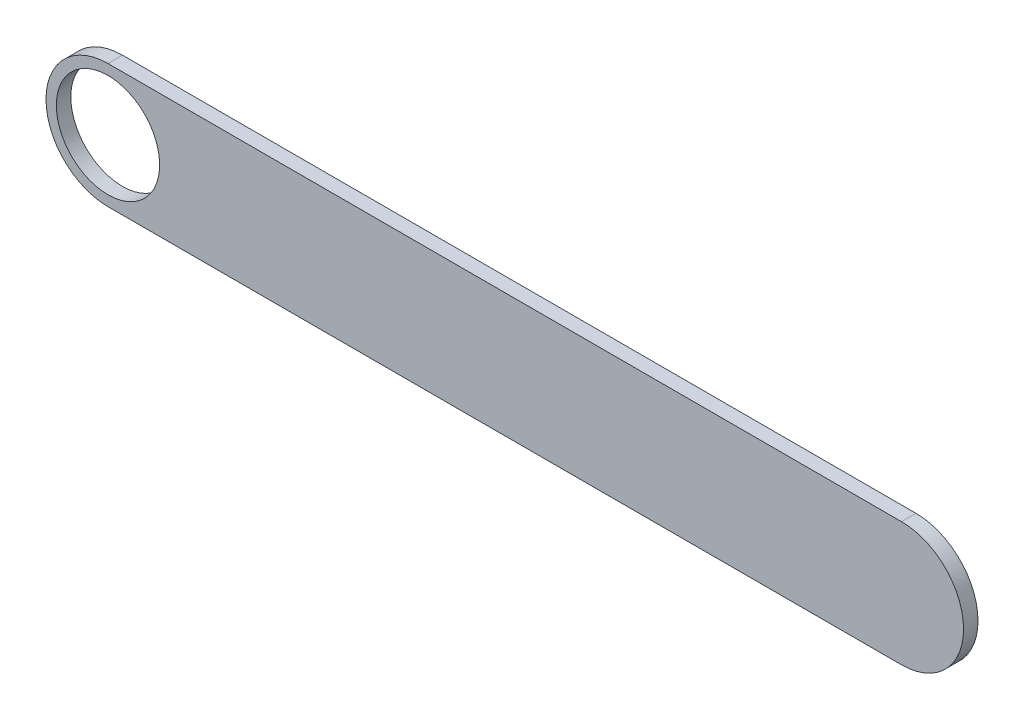
ISO-10303-21;
HEADER;
FILE_DESCRIPTION(('STEP AP214'),'2;1');
FILE_NAME('part.step','',(''),(''),'','','');
FILE_SCHEMA(('AUTOMOTIVE_DESIGN { 1 0 10303 214 1 1 1 1 }'));
ENDSEC;
DATA;
#1=APPLICATION_CONTEXT('core data for automotive mechanical design processes');
#2=APPLICATION_PROTOCOL_DEFINITION('international standard','automotive_design',2000,#1);
#3=PRODUCT_CONTEXT('',#1,'mechanical');
#4=PRODUCT('Part','Part','',(#3));
#5=PRODUCT_RELATED_PRODUCT_CATEGORY('part','',(#4));
#6=PRODUCT_DEFINITION_FORMATION('','',#4);
#7=PRODUCT_DEFINITION_CONTEXT('part definition',#1,'design');
#8=PRODUCT_DEFINITION('design','',#6,#7);
#9=PRODUCT_DEFINITION_SHAPE('','',#8);
#10=(LENGTH_UNIT() NAMED_UNIT(*) SI_UNIT(.MILLI.,.METRE.));
#11=(NAMED_UNIT(*) PLANE_ANGLE_UNIT() SI_UNIT($,.RADIAN.));
#12=(NAMED_UNIT(*) SI_UNIT($,.STERADIAN.) SOLID_ANGLE_UNIT());
#13=UNCERTAINTY_MEASURE_WITH_UNIT(LENGTH_MEASURE(1.E-05),#10,'distance_accuracy_value','');
#14=(GEOMETRIC_REPRESENTATION_CONTEXT(3) GLOBAL_UNCERTAINTY_ASSIGNED_CONTEXT((#13)) GLOBAL_UNIT_ASSIGNED_CONTEXT((#10,
#11,#12)) REPRESENTATION_CONTEXT('',''));
#15=CARTESIAN_POINT('',(0.,0.,0.));
#16=DIRECTION('',(0.,0.,1.));
#17=DIRECTION('',(1.,0.,0.));
#18=AXIS2_PLACEMENT_3D('',#15,#16,#17);
#19=CARTESIAN_POINT('',(125.63,-68.51,-0.045));
#20=DIRECTION('',(0.,0.,-1.));
#21=DIRECTION('',(0.,-1.,0.));
#22=AXIS2_PLACEMENT_3D('',#19,#20,#21);
#23=CYLINDRICAL_SURFACE('',#22,0.125);
#24=CARTESIAN_POINT('',(125.63,-68.51,-0.035));
#25=DIRECTION('',(0.,0.,-1.));
#26=DIRECTION('',(0.,-1.,0.));
#27=AXIS2_PLACEMENT_3D('',#24,#25,#26);
#28=CIRCLE('',#27,0.125);
#29=CARTESIAN_POINT('',(125.63,-68.635,-0.035));
#30=VERTEX_POINT('',#29);
#31=EDGE_CURVE('E68',#30,#30,#28,.T.);
#32=ORIENTED_EDGE('',*,*,#31,.T.);
#33=DIRECTION('',(0.,0.,1.));
#34=VECTOR('',#33,1.);
#35=CARTESIAN_POINT('',(125.63,-68.635,-0.045));
#36=LINE('',#35,#34);
#37=CARTESIAN_POINT('',(125.63,-68.635,0.));
#38=VERTEX_POINT('',#37);
#39=EDGE_CURVE('E11',#30,#38,#36,.T.);
#40=ORIENTED_EDGE('',*,*,#39,.T.);
#41=CARTESIAN_POINT('',(125.63,-68.51,0.));
#42=DIRECTION('',(0.,0.,-1.));
#43=DIRECTION('',(0.,-1.,0.));
#44=AXIS2_PLACEMENT_3D('',#41,#42,#43);
#45=CIRCLE('',#44,0.125);
#46=EDGE_CURVE('E21',#38,#38,#45,.T.);
#47=ORIENTED_EDGE('',*,*,#46,.F.);
#48=ORIENTED_EDGE('',*,*,#39,.F.);
#49=EDGE_LOOP('',(#32,#40,#47,#48));
#50=FACE_BOUND('',#49,.T.);
#51=ADVANCED_FACE('F17',(#50),#23,.F.);
#52=CARTESIAN_POINT('',(127.55,-68.36,-0.035));
#53=DIRECTION('',(0.,-1.,0.));
#54=DIRECTION('',(0.,0.,-1.));
#55=AXIS2_PLACEMENT_3D('',#52,#53,#54);
#56=PLANE('',#55);
#57=DIRECTION('',(-1.,0.,0.));
#58=VECTOR('',#57,1.);
#59=CARTESIAN_POINT('',(127.55,-68.36,-0.035));
#60=LINE('',#59,#58);
#61=CARTESIAN_POINT('',(127.55,-68.36,-0.035));
#62=VERTEX_POINT('',#61);
#63=CARTESIAN_POINT('',(125.63,-68.36,-0.035));
#64=VERTEX_POINT('',#63);
#65=EDGE_CURVE('E79',#62,#64,#60,.T.);
#66=ORIENTED_EDGE('',*,*,#65,.T.);
#67=DIRECTION('',(0.,0.,1.));
#68=VECTOR('',#67,1.);
#69=CARTESIAN_POINT('',(125.63,-68.36,-0.035));
#70=LINE('',#69,#68);
#71=CARTESIAN_POINT('',(125.63,-68.36,0.));
#72=VERTEX_POINT('',#71);
#73=EDGE_CURVE('E63',#64,#72,#70,.T.);
#74=ORIENTED_EDGE('',*,*,#73,.T.);
#75=DIRECTION('',(-1.,0.,0.));
#76=VECTOR('',#75,1.);
#77=CARTESIAN_POINT('',(127.55,-68.36,0.));
#78=LINE('',#77,#76);
#79=CARTESIAN_POINT('',(127.55,-68.36,0.));
#80=VERTEX_POINT('',#79);
#81=EDGE_CURVE('E55',#80,#72,#78,.T.);
#82=ORIENTED_EDGE('',*,*,#81,.F.);
#83=DIRECTION('',(0.,0.,1.));
#84=VECTOR('',#83,1.);
#85=CARTESIAN_POINT('',(127.55,-68.36,-0.035));
#86=LINE('',#85,#84);
#87=EDGE_CURVE('E60',#62,#80,#86,.T.);
#88=ORIENTED_EDGE('',*,*,#87,.F.);
#89=EDGE_LOOP('',(#66,#74,#82,#88));
#90=FACE_BOUND('',#89,.T.);
#91=ADVANCED_FACE('F58',(#90),#56,.F.);
#92=CARTESIAN_POINT('',(125.63,-68.66,0.));
#93=DIRECTION('',(0.,0.,1.));
#94=DIRECTION('',(1.,0.,0.));
#95=AXIS2_PLACEMENT_3D('',#92,#93,#94);
#96=PLANE('',#95);
#97=ORIENTED_EDGE('',*,*,#46,.T.);
#98=EDGE_LOOP('',(#97));
#99=FACE_BOUND('',#98,.T.);
#100=DIRECTION('',(1.,0.,0.));
#101=VECTOR('',#100,1.);
#102=CARTESIAN_POINT('',(125.63,-68.66,0.));
#103=LINE('',#102,#101);
#104=CARTESIAN_POINT('',(125.63,-68.66,0.));
#105=VERTEX_POINT('',#104);
#106=CARTESIAN_POINT('',(127.55,-68.66,0.));
#107=VERTEX_POINT('',#106);
#108=EDGE_CURVE('E74',#105,#107,#103,.T.);
#109=ORIENTED_EDGE('',*,*,#108,.T.);
#110=CARTESIAN_POINT('',(127.55,-68.51,0.));
#111=DIRECTION('',(0.,0.,1.));
#112=DIRECTION('',(0.,-1.,0.));
#113=AXIS2_PLACEMENT_3D('',#110,#111,#112);
#114=CIRCLE('',#113,0.15);
#115=EDGE_CURVE('E71',#107,#80,#114,.T.);
#116=ORIENTED_EDGE('',*,*,#115,.T.);
#117=ORIENTED_EDGE('',*,*,#81,.T.);
#118=CARTESIAN_POINT('',(125.63,-68.51,0.));
#119=DIRECTION('',(0.,0.,1.));
#120=DIRECTION('',(0.,1.,0.));
#121=AXIS2_PLACEMENT_3D('',#118,#119,#120);
#122=CIRCLE('',#121,0.15);
#123=EDGE_CURVE('E111',#72,#105,#122,.T.);
#124=ORIENTED_EDGE('',*,*,#123,.T.);
#125=EDGE_LOOP('',(#109,#116,#117,#124));
#126=FACE_BOUND('',#125,.T.);
#127=ADVANCED_FACE('F19',(#99,#126),#96,.T.);
#128=CARTESIAN_POINT('',(125.63,-68.66,-0.035));
#129=DIRECTION('',(0.,0.,1.));
#130=DIRECTION('',(1.,0.,0.));
#131=AXIS2_PLACEMENT_3D('',#128,#129,#130);
#132=PLANE('',#131);
#133=ORIENTED_EDGE('',*,*,#31,.F.);
#134=EDGE_LOOP('',(#133));
#135=FACE_BOUND('',#134,.T.);
#136=CARTESIAN_POINT('',(125.63,-68.51,-0.035));
#137=DIRECTION('',(0.,0.,1.));
#138=DIRECTION('',(0.,1.,0.));
#139=AXIS2_PLACEMENT_3D('',#136,#137,#138);
#140=CIRCLE('',#139,0.15);
#141=CARTESIAN_POINT('',(125.63,-68.66,-0.035));
#142=VERTEX_POINT('',#141);
#143=EDGE_CURVE('E107',#64,#142,#140,.T.);
#144=ORIENTED_EDGE('',*,*,#143,.F.);
#145=ORIENTED_EDGE('',*,*,#65,.F.);
#146=CARTESIAN_POINT('',(127.55,-68.51,-0.035));
#147=DIRECTION('',(0.,0.,1.));
#148=DIRECTION('',(0.,-1.,0.));
#149=AXIS2_PLACEMENT_3D('',#146,#147,#148);
#150=CIRCLE('',#149,0.15);
#151=CARTESIAN_POINT('',(127.55,-68.66,-0.035));
#152=VERTEX_POINT('',#151);
#153=EDGE_CURVE('E83',#152,#62,#150,.T.);
#154=ORIENTED_EDGE('',*,*,#153,.F.);
#155=DIRECTION('',(1.,0.,0.));
#156=VECTOR('',#155,1.);
#157=CARTESIAN_POINT('',(125.63,-68.66,-0.035));
#158=LINE('',#157,#156);
#159=EDGE_CURVE('E140',#142,#152,#158,.T.);
#160=ORIENTED_EDGE('',*,*,#159,.F.);
#161=EDGE_LOOP('',(#144,#145,#154,#160));
#162=FACE_BOUND('',#161,.T.);
#163=ADVANCED_FACE('F160',(#135,#162),#132,.F.);
#164=CARTESIAN_POINT('',(127.55,-68.51,-0.035));
#165=DIRECTION('',(0.,0.,-1.));
#166=DIRECTION('',(0.,-1.,0.));
#167=AXIS2_PLACEMENT_3D('',#164,#165,#166);
#168=CYLINDRICAL_SURFACE('',#167,0.15);
#169=ORIENTED_EDGE('',*,*,#153,.T.);
#170=ORIENTED_EDGE('',*,*,#87,.T.);
#171=ORIENTED_EDGE('',*,*,#115,.F.);
#172=DIRECTION('',(0.,0.,1.));
#173=VECTOR('',#172,1.);
#174=CARTESIAN_POINT('',(127.55,-68.66,-0.035));
#175=LINE('',#174,#173);
#176=EDGE_CURVE('E134',#152,#107,#175,.T.);
#177=ORIENTED_EDGE('',*,*,#176,.F.);
#178=EDGE_LOOP('',(#169,#170,#171,#177));
#179=FACE_BOUND('',#178,.T.);
#180=ADVANCED_FACE('F81',(#179),#168,.T.);
#181=CARTESIAN_POINT('',(125.63,-68.51,-0.035));
#182=DIRECTION('',(0.,0.,-1.));
#183=DIRECTION('',(0.,1.,0.));
#184=AXIS2_PLACEMENT_3D('',#181,#182,#183);
#185=CYLINDRICAL_SURFACE('',#184,0.15);
#186=ORIENTED_EDGE('',*,*,#143,.T.);
#187=DIRECTION('',(0.,0.,1.));
#188=VECTOR('',#187,1.);
#189=CARTESIAN_POINT('',(125.63,-68.66,-0.035));
#190=LINE('',#189,#188);
#191=EDGE_CURVE('E103',#142,#105,#190,.T.);
#192=ORIENTED_EDGE('',*,*,#191,.T.);
#193=ORIENTED_EDGE('',*,*,#123,.F.);
#194=ORIENTED_EDGE('',*,*,#73,.F.);
#195=EDGE_LOOP('',(#186,#192,#193,#194));
#196=FACE_BOUND('',#195,.T.);
#197=ADVANCED_FACE('F173',(#196),#185,.T.);
#198=CARTESIAN_POINT('',(125.63,-68.66,-0.035));
#199=DIRECTION('',(0.,1.,0.));
#200=DIRECTION('',(1.,0.,0.));
#201=AXIS2_PLACEMENT_3D('',#198,#199,#200);
#202=PLANE('',#201);
#203=ORIENTED_EDGE('',*,*,#159,.T.);
#204=ORIENTED_EDGE('',*,*,#176,.T.);
#205=ORIENTED_EDGE('',*,*,#108,.F.);
#206=ORIENTED_EDGE('',*,*,#191,.F.);
#207=EDGE_LOOP('',(#203,#204,#205,#206));
#208=FACE_BOUND('',#207,.T.);
#209=ADVANCED_FACE('F154',(#208),#202,.F.);
#210=CLOSED_SHELL('',(#51,#91,#127,#163,#180,#197,#209));
#211=MANIFOLD_SOLID_BREP('B1',#210);
#212=ADVANCED_BREP_SHAPE_REPRESENTATION('',(#18,#211),#14);
#213=SHAPE_DEFINITION_REPRESENTATION(#9,#212);
ENDSEC;
END-ISO-10303-21;
